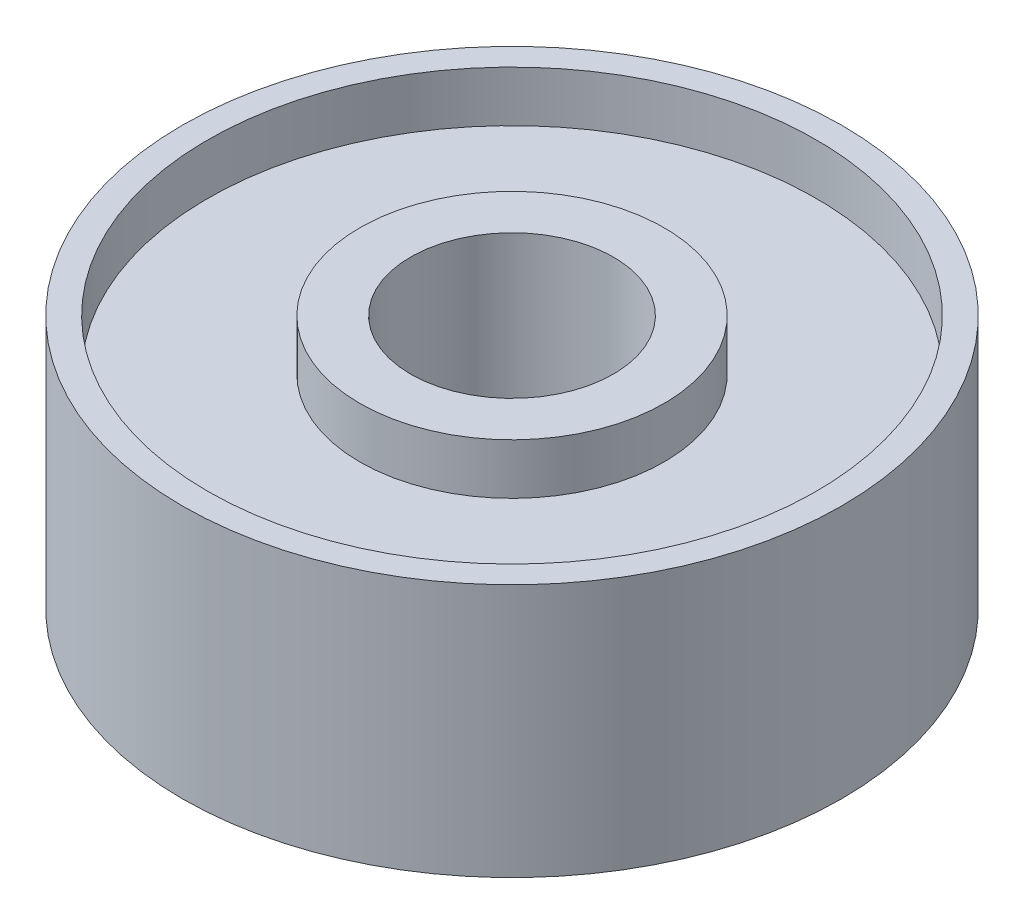
ISO-10303-21;
HEADER;
FILE_DESCRIPTION(('STEP AP214'),'2;1');
FILE_NAME('part.step','',(''),(''),'','','');
FILE_SCHEMA(('AUTOMOTIVE_DESIGN { 1 0 10303 214 1 1 1 1 }'));
ENDSEC;
DATA;
#1=APPLICATION_CONTEXT('core data for automotive mechanical design processes');
#2=APPLICATION_PROTOCOL_DEFINITION('international standard','automotive_design',2000,#1);
#3=PRODUCT_CONTEXT('',#1,'mechanical');
#4=PRODUCT('Part','Part','',(#3));
#5=PRODUCT_RELATED_PRODUCT_CATEGORY('part','',(#4));
#6=PRODUCT_DEFINITION_FORMATION('','',#4);
#7=PRODUCT_DEFINITION_CONTEXT('part definition',#1,'design');
#8=PRODUCT_DEFINITION('design','',#6,#7);
#9=PRODUCT_DEFINITION_SHAPE('','',#8);
#10=(LENGTH_UNIT() NAMED_UNIT(*) SI_UNIT(.MILLI.,.METRE.));
#11=(NAMED_UNIT(*) PLANE_ANGLE_UNIT() SI_UNIT($,.RADIAN.));
#12=(NAMED_UNIT(*) SI_UNIT($,.STERADIAN.) SOLID_ANGLE_UNIT());
#13=UNCERTAINTY_MEASURE_WITH_UNIT(LENGTH_MEASURE(1.E-05),#10,'distance_accuracy_value','');
#14=(GEOMETRIC_REPRESENTATION_CONTEXT(3) GLOBAL_UNCERTAINTY_ASSIGNED_CONTEXT((#13)) GLOBAL_UNIT_ASSIGNED_CONTEXT((#10,
#11,#12)) REPRESENTATION_CONTEXT('',''));
#15=CARTESIAN_POINT('',(0.,0.,0.));
#16=DIRECTION('',(0.,0.,1.));
#17=DIRECTION('',(1.,0.,0.));
#18=AXIS2_PLACEMENT_3D('',#15,#16,#17);
#19=CARTESIAN_POINT('',(0.,0.,0.));
#20=DIRECTION('',(0.,1.,0.));
#21=DIRECTION('',(0.,0.,1.));
#22=AXIS2_PLACEMENT_3D('',#19,#20,#21);
#23=PLANE('',#22);
#24=CARTESIAN_POINT('',(0.,0.,0.));
#25=DIRECTION('',(0.,1.,0.));
#26=DIRECTION('',(0.,0.,1.));
#27=AXIS2_PLACEMENT_3D('',#24,#25,#26);
#28=CIRCLE('',#27,2.);
#29=CARTESIAN_POINT('',(0.,0.,2.));
#30=VERTEX_POINT('',#29);
#31=EDGE_CURVE('E45',#30,#30,#28,.T.);
#32=ORIENTED_EDGE('',*,*,#31,.T.);
#33=EDGE_LOOP('',(#32));
#34=FACE_BOUND('',#33,.T.);
#35=CARTESIAN_POINT('',(0.,0.,0.));
#36=DIRECTION('',(0.,-1.,0.));
#37=DIRECTION('',(0.,0.,-1.));
#38=AXIS2_PLACEMENT_3D('',#35,#36,#37);
#39=CIRCLE('',#38,3.);
#40=CARTESIAN_POINT('',(0.,0.,-3.));
#41=VERTEX_POINT('',#40);
#42=EDGE_CURVE('E69',#41,#41,#39,.T.);
#43=ORIENTED_EDGE('',*,*,#42,.T.);
#44=EDGE_LOOP('',(#43));
#45=FACE_BOUND('',#44,.T.);
#46=ADVANCED_FACE('F32',(#34,#45),#23,.F.);
#47=CARTESIAN_POINT('',(0.,5.,0.));
#48=DIRECTION('',(0.,1.,0.));
#49=DIRECTION('',(0.,0.,1.));
#50=AXIS2_PLACEMENT_3D('',#47,#48,#49);
#51=PLANE('',#50);
#52=CARTESIAN_POINT('',(0.,5.,0.));
#53=DIRECTION('',(0.,1.,0.));
#54=DIRECTION('',(0.,0.,1.));
#55=AXIS2_PLACEMENT_3D('',#52,#53,#54);
#56=CIRCLE('',#55,2.);
#57=CARTESIAN_POINT('',(0.,5.,2.));
#58=VERTEX_POINT('',#57);
#59=EDGE_CURVE('E43',#58,#58,#56,.T.);
#60=ORIENTED_EDGE('',*,*,#59,.F.);
#61=EDGE_LOOP('',(#60));
#62=FACE_BOUND('',#61,.T.);
#63=CARTESIAN_POINT('',(0.,5.,0.));
#64=DIRECTION('',(0.,1.,0.));
#65=DIRECTION('',(0.,0.,1.));
#66=AXIS2_PLACEMENT_3D('',#63,#64,#65);
#67=CIRCLE('',#66,3.);
#68=CARTESIAN_POINT('',(0.,5.,3.));
#69=VERTEX_POINT('',#68);
#70=EDGE_CURVE('E57',#69,#69,#67,.T.);
#71=ORIENTED_EDGE('',*,*,#70,.T.);
#72=EDGE_LOOP('',(#71));
#73=FACE_BOUND('',#72,.T.);
#74=ADVANCED_FACE('F107',(#62,#73),#51,.T.);
#75=CARTESIAN_POINT('',(0.,5.,0.));
#76=DIRECTION('',(0.,1.,0.));
#77=DIRECTION('',(0.,0.,1.));
#78=AXIS2_PLACEMENT_3D('',#75,#76,#77);
#79=CIRCLE('',#78,6.);
#80=CARTESIAN_POINT('',(0.,5.,6.));
#81=VERTEX_POINT('',#80);
#82=EDGE_CURVE('E51',#81,#81,#79,.T.);
#83=ORIENTED_EDGE('',*,*,#82,.F.);
#84=EDGE_LOOP('',(#83));
#85=FACE_BOUND('',#84,.T.);
#86=CARTESIAN_POINT('',(0.,5.,0.));
#87=DIRECTION('',(0.,1.,0.));
#88=DIRECTION('',(0.,0.,1.));
#89=AXIS2_PLACEMENT_3D('',#86,#87,#88);
#90=CIRCLE('',#89,6.5);
#91=CARTESIAN_POINT('',(0.,5.,6.5));
#92=VERTEX_POINT('',#91);
#93=EDGE_CURVE('E10',#92,#92,#90,.T.);
#94=ORIENTED_EDGE('',*,*,#93,.T.);
#95=EDGE_LOOP('',(#94));
#96=FACE_BOUND('',#95,.T.);
#97=ADVANCED_FACE('F94',(#85,#96),#51,.T.);
#98=CARTESIAN_POINT('',(0.,0.,0.));
#99=DIRECTION('',(0.,-1.,0.));
#100=DIRECTION('',(0.,0.,-1.));
#101=AXIS2_PLACEMENT_3D('',#98,#99,#100);
#102=CIRCLE('',#101,6.);
#103=CARTESIAN_POINT('',(0.,0.,-6.));
#104=VERTEX_POINT('',#103);
#105=EDGE_CURVE('E63',#104,#104,#102,.T.);
#106=ORIENTED_EDGE('',*,*,#105,.F.);
#107=EDGE_LOOP('',(#106));
#108=FACE_BOUND('',#107,.T.);
#109=CARTESIAN_POINT('',(0.,0.,0.));
#110=DIRECTION('',(0.,1.,0.));
#111=DIRECTION('',(0.,0.,1.));
#112=AXIS2_PLACEMENT_3D('',#109,#110,#111);
#113=CIRCLE('',#112,6.5);
#114=CARTESIAN_POINT('',(0.,0.,6.5));
#115=VERTEX_POINT('',#114);
#116=EDGE_CURVE('E36',#115,#115,#113,.T.);
#117=ORIENTED_EDGE('',*,*,#116,.F.);
#118=EDGE_LOOP('',(#117));
#119=FACE_BOUND('',#118,.T.);
#120=ADVANCED_FACE('F91',(#108,#119),#23,.F.);
#121=CARTESIAN_POINT('',(0.,5.,0.));
#122=DIRECTION('',(0.,-1.,0.));
#123=DIRECTION('',(0.,0.,-1.));
#124=AXIS2_PLACEMENT_3D('',#121,#122,#123);
#125=CYLINDRICAL_SURFACE('',#124,6.5);
#126=ORIENTED_EDGE('',*,*,#93,.F.);
#127=EDGE_LOOP('',(#126));
#128=FACE_BOUND('',#127,.T.);
#129=ORIENTED_EDGE('',*,*,#116,.T.);
#130=EDGE_LOOP('',(#129));
#131=FACE_BOUND('',#130,.T.);
#132=ADVANCED_FACE('F34',(#128,#131),#125,.T.);
#133=CARTESIAN_POINT('',(0.,5.,0.));
#134=DIRECTION('',(0.,-1.,0.));
#135=DIRECTION('',(0.,0.,-1.));
#136=AXIS2_PLACEMENT_3D('',#133,#134,#135);
#137=CYLINDRICAL_SURFACE('',#136,2.);
#138=ORIENTED_EDGE('',*,*,#59,.T.);
#139=EDGE_LOOP('',(#138));
#140=FACE_BOUND('',#139,.T.);
#141=ORIENTED_EDGE('',*,*,#31,.F.);
#142=EDGE_LOOP('',(#141));
#143=FACE_BOUND('',#142,.T.);
#144=ADVANCED_FACE('F98',(#140,#143),#137,.F.);
#145=CARTESIAN_POINT('',(0.,4.,0.));
#146=DIRECTION('',(0.,1.,0.));
#147=DIRECTION('',(0.,0.,1.));
#148=AXIS2_PLACEMENT_3D('',#145,#146,#147);
#149=CYLINDRICAL_SURFACE('',#148,6.);
#150=CARTESIAN_POINT('',(0.,4.,0.));
#151=DIRECTION('',(0.,1.,0.));
#152=DIRECTION('',(0.,0.,1.));
#153=AXIS2_PLACEMENT_3D('',#150,#151,#152);
#154=CIRCLE('',#153,6.);
#155=CARTESIAN_POINT('',(0.,4.,6.));
#156=VERTEX_POINT('',#155);
#157=EDGE_CURVE('E48',#156,#156,#154,.T.);
#158=ORIENTED_EDGE('',*,*,#157,.F.);
#159=EDGE_LOOP('',(#158));
#160=FACE_BOUND('',#159,.T.);
#161=ORIENTED_EDGE('',*,*,#82,.T.);
#162=EDGE_LOOP('',(#161));
#163=FACE_BOUND('',#162,.T.);
#164=ADVANCED_FACE('F103',(#160,#163),#149,.F.);
#165=CARTESIAN_POINT('',(0.,4.,0.));
#166=DIRECTION('',(0.,1.,0.));
#167=DIRECTION('',(0.,0.,1.));
#168=AXIS2_PLACEMENT_3D('',#165,#166,#167);
#169=PLANE('',#168);
#170=CARTESIAN_POINT('',(0.,4.,0.));
#171=DIRECTION('',(0.,1.,0.));
#172=DIRECTION('',(0.,0.,1.));
#173=AXIS2_PLACEMENT_3D('',#170,#171,#172);
#174=CIRCLE('',#173,3.);
#175=CARTESIAN_POINT('',(0.,4.,3.));
#176=VERTEX_POINT('',#175);
#177=EDGE_CURVE('E54',#176,#176,#174,.T.);
#178=ORIENTED_EDGE('',*,*,#177,.F.);
#179=EDGE_LOOP('',(#178));
#180=FACE_BOUND('',#179,.T.);
#181=ORIENTED_EDGE('',*,*,#157,.T.);
#182=EDGE_LOOP('',(#181));
#183=FACE_BOUND('',#182,.T.);
#184=ADVANCED_FACE('F120',(#180,#183),#169,.T.);
#185=CARTESIAN_POINT('',(0.,4.,0.));
#186=DIRECTION('',(0.,1.,0.));
#187=DIRECTION('',(0.,0.,1.));
#188=AXIS2_PLACEMENT_3D('',#185,#186,#187);
#189=CYLINDRICAL_SURFACE('',#188,3.);
#190=ORIENTED_EDGE('',*,*,#177,.T.);
#191=EDGE_LOOP('',(#190));
#192=FACE_BOUND('',#191,.T.);
#193=ORIENTED_EDGE('',*,*,#70,.F.);
#194=EDGE_LOOP('',(#193));
#195=FACE_BOUND('',#194,.T.);
#196=ADVANCED_FACE('F87',(#192,#195),#189,.T.);
#197=CARTESIAN_POINT('',(0.,1.,0.));
#198=DIRECTION('',(0.,-1.,0.));
#199=DIRECTION('',(0.,0.,-1.));
#200=AXIS2_PLACEMENT_3D('',#197,#198,#199);
#201=CYLINDRICAL_SURFACE('',#200,6.);
#202=CARTESIAN_POINT('',(0.,1.,0.));
#203=DIRECTION('',(0.,-1.,0.));
#204=DIRECTION('',(0.,0.,-1.));
#205=AXIS2_PLACEMENT_3D('',#202,#203,#204);
#206=CIRCLE('',#205,6.);
#207=CARTESIAN_POINT('',(0.,1.,-6.));
#208=VERTEX_POINT('',#207);
#209=EDGE_CURVE('E60',#208,#208,#206,.T.);
#210=ORIENTED_EDGE('',*,*,#209,.F.);
#211=EDGE_LOOP('',(#210));
#212=FACE_BOUND('',#211,.T.);
#213=ORIENTED_EDGE('',*,*,#105,.T.);
#214=EDGE_LOOP('',(#213));
#215=FACE_BOUND('',#214,.T.);
#216=ADVANCED_FACE('F81',(#212,#215),#201,.F.);
#217=CARTESIAN_POINT('',(0.,1.,0.));
#218=DIRECTION('',(0.,-1.,0.));
#219=DIRECTION('',(0.,0.,-1.));
#220=AXIS2_PLACEMENT_3D('',#217,#218,#219);
#221=PLANE('',#220);
#222=CARTESIAN_POINT('',(0.,1.,0.));
#223=DIRECTION('',(0.,-1.,0.));
#224=DIRECTION('',(0.,0.,-1.));
#225=AXIS2_PLACEMENT_3D('',#222,#223,#224);
#226=CIRCLE('',#225,3.);
#227=CARTESIAN_POINT('',(0.,1.,-3.));
#228=VERTEX_POINT('',#227);
#229=EDGE_CURVE('E66',#228,#228,#226,.T.);
#230=ORIENTED_EDGE('',*,*,#229,.F.);
#231=EDGE_LOOP('',(#230));
#232=FACE_BOUND('',#231,.T.);
#233=ORIENTED_EDGE('',*,*,#209,.T.);
#234=EDGE_LOOP('',(#233));
#235=FACE_BOUND('',#234,.T.);
#236=ADVANCED_FACE('F78',(#232,#235),#221,.T.);
#237=CARTESIAN_POINT('',(0.,1.,0.));
#238=DIRECTION('',(0.,-1.,0.));
#239=DIRECTION('',(0.,0.,-1.));
#240=AXIS2_PLACEMENT_3D('',#237,#238,#239);
#241=CYLINDRICAL_SURFACE('',#240,3.);
#242=ORIENTED_EDGE('',*,*,#229,.T.);
#243=EDGE_LOOP('',(#242));
#244=FACE_BOUND('',#243,.T.);
#245=ORIENTED_EDGE('',*,*,#42,.F.);
#246=EDGE_LOOP('',(#245));
#247=FACE_BOUND('',#246,.T.);
#248=ADVANCED_FACE('F75',(#244,#247),#241,.T.);
#249=CLOSED_SHELL('',(#46,#74,#97,#120,#132,#144,#164,#184,#196,#216,#236,#248));
#250=MANIFOLD_SOLID_BREP('B2',#249);
#251=ADVANCED_BREP_SHAPE_REPRESENTATION('',(#18,#250),#14);
#252=SHAPE_DEFINITION_REPRESENTATION(#9,#251);
ENDSEC;
END-ISO-10303-21;
